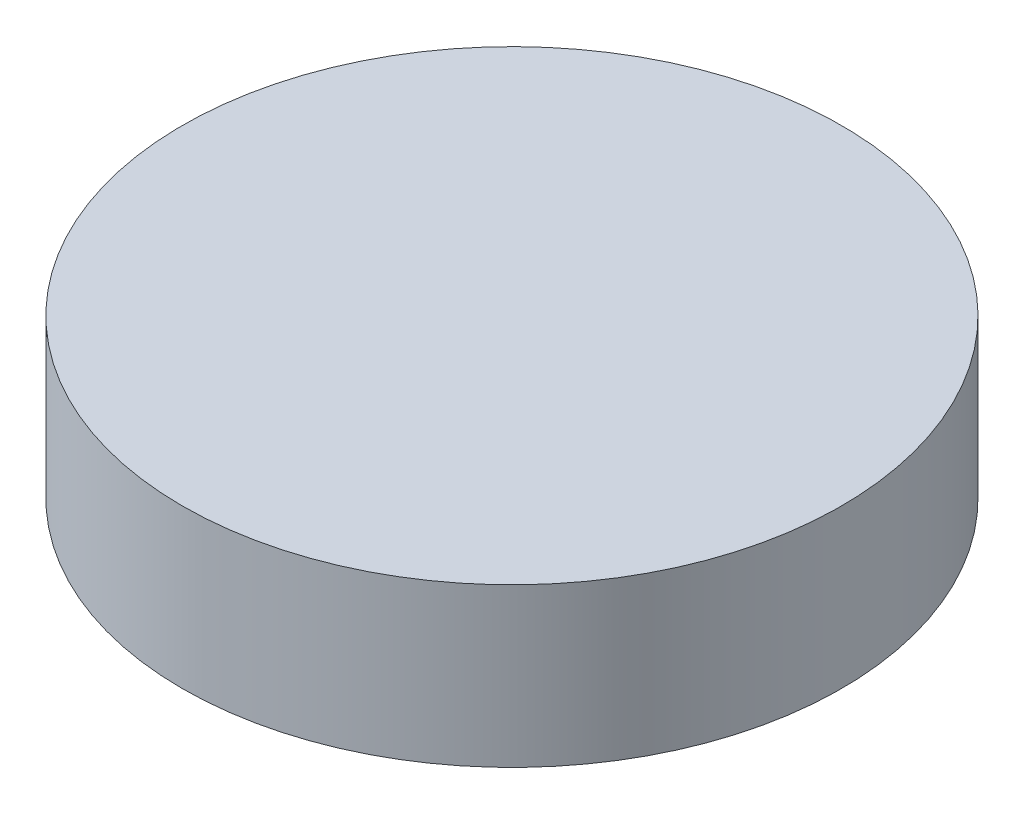
ISO-10303-21;
HEADER;
FILE_DESCRIPTION(('STEP AP214'),'2;1');
FILE_NAME('part.step','',(''),(''),'','','');
FILE_SCHEMA(('AUTOMOTIVE_DESIGN { 1 0 10303 214 1 1 1 1 }'));
ENDSEC;
DATA;
#1=APPLICATION_CONTEXT('core data for automotive mechanical design processes');
#2=APPLICATION_PROTOCOL_DEFINITION('international standard','automotive_design',2000,#1);
#3=PRODUCT_CONTEXT('',#1,'mechanical');
#4=PRODUCT('Part','Part','',(#3));
#5=PRODUCT_RELATED_PRODUCT_CATEGORY('part','',(#4));
#6=PRODUCT_DEFINITION_FORMATION('','',#4);
#7=PRODUCT_DEFINITION_CONTEXT('part definition',#1,'design');
#8=PRODUCT_DEFINITION('design','',#6,#7);
#9=PRODUCT_DEFINITION_SHAPE('','',#8);
#10=(LENGTH_UNIT() NAMED_UNIT(*) SI_UNIT(.MILLI.,.METRE.));
#11=(NAMED_UNIT(*) PLANE_ANGLE_UNIT() SI_UNIT($,.RADIAN.));
#12=(NAMED_UNIT(*) SI_UNIT($,.STERADIAN.) SOLID_ANGLE_UNIT());
#13=UNCERTAINTY_MEASURE_WITH_UNIT(LENGTH_MEASURE(1.E-05),#10,'distance_accuracy_value','');
#14=(GEOMETRIC_REPRESENTATION_CONTEXT(3) GLOBAL_UNCERTAINTY_ASSIGNED_CONTEXT((#13)) GLOBAL_UNIT_ASSIGNED_CONTEXT((#10,
#11,#12)) REPRESENTATION_CONTEXT('',''));
#15=CARTESIAN_POINT('',(0.,0.,0.));
#16=DIRECTION('',(0.,0.,1.));
#17=DIRECTION('',(1.,0.,0.));
#18=AXIS2_PLACEMENT_3D('',#15,#16,#17);
#19=CARTESIAN_POINT('',(50.,12.,-770.));
#20=DIRECTION('',(0.,-1.,0.));
#21=DIRECTION('',(0.,0.,-1.));
#22=AXIS2_PLACEMENT_3D('',#19,#20,#21);
#23=CYLINDRICAL_SURFACE('',#22,25.);
#24=CARTESIAN_POINT('',(50.,12.,-770.));
#25=DIRECTION('',(0.,1.,0.));
#26=DIRECTION('',(0.,0.,1.));
#27=AXIS2_PLACEMENT_3D('',#24,#25,#26);
#28=CIRCLE('',#27,25.);
#29=CARTESIAN_POINT('',(50.,12.,-745.));
#30=VERTEX_POINT('',#29);
#31=EDGE_CURVE('E10',#30,#30,#28,.T.);
#32=ORIENTED_EDGE('',*,*,#31,.F.);
#33=EDGE_LOOP('',(#32));
#34=FACE_BOUND('',#33,.T.);
#35=CARTESIAN_POINT('',(50.,0.,-770.));
#36=DIRECTION('',(0.,1.,0.));
#37=DIRECTION('',(0.,0.,1.));
#38=AXIS2_PLACEMENT_3D('',#35,#36,#37);
#39=CIRCLE('',#38,25.);
#40=CARTESIAN_POINT('',(50.,0.,-745.));
#41=VERTEX_POINT('',#40);
#42=EDGE_CURVE('E40',#41,#41,#39,.T.);
#43=ORIENTED_EDGE('',*,*,#42,.T.);
#44=EDGE_LOOP('',(#43));
#45=FACE_BOUND('',#44,.T.);
#46=ADVANCED_FACE('F37',(#34,#45),#23,.T.);
#47=CARTESIAN_POINT('',(50.,12.,-770.));
#48=DIRECTION('',(0.,1.,0.));
#49=DIRECTION('',(0.,0.,1.));
#50=AXIS2_PLACEMENT_3D('',#47,#48,#49);
#51=PLANE('',#50);
#52=ORIENTED_EDGE('',*,*,#31,.T.);
#53=EDGE_LOOP('',(#52));
#54=FACE_BOUND('',#53,.T.);
#55=ADVANCED_FACE('F52',(#54),#51,.T.);
#56=CARTESIAN_POINT('',(50.,0.,-770.));
#57=DIRECTION('',(0.,1.,0.));
#58=DIRECTION('',(0.,0.,1.));
#59=AXIS2_PLACEMENT_3D('',#56,#57,#58);
#60=PLANE('',#59);
#61=ORIENTED_EDGE('',*,*,#42,.F.);
#62=EDGE_LOOP('',(#61));
#63=FACE_BOUND('',#62,.T.);
#64=ADVANCED_FACE('F50',(#63),#60,.F.);
#65=CLOSED_SHELL('',(#46,#55,#64));
#66=MANIFOLD_SOLID_BREP('B2',#65);
#67=ADVANCED_BREP_SHAPE_REPRESENTATION('',(#18,#66),#14);
#68=SHAPE_DEFINITION_REPRESENTATION(#9,#67);
ENDSEC;
END-ISO-10303-21;
